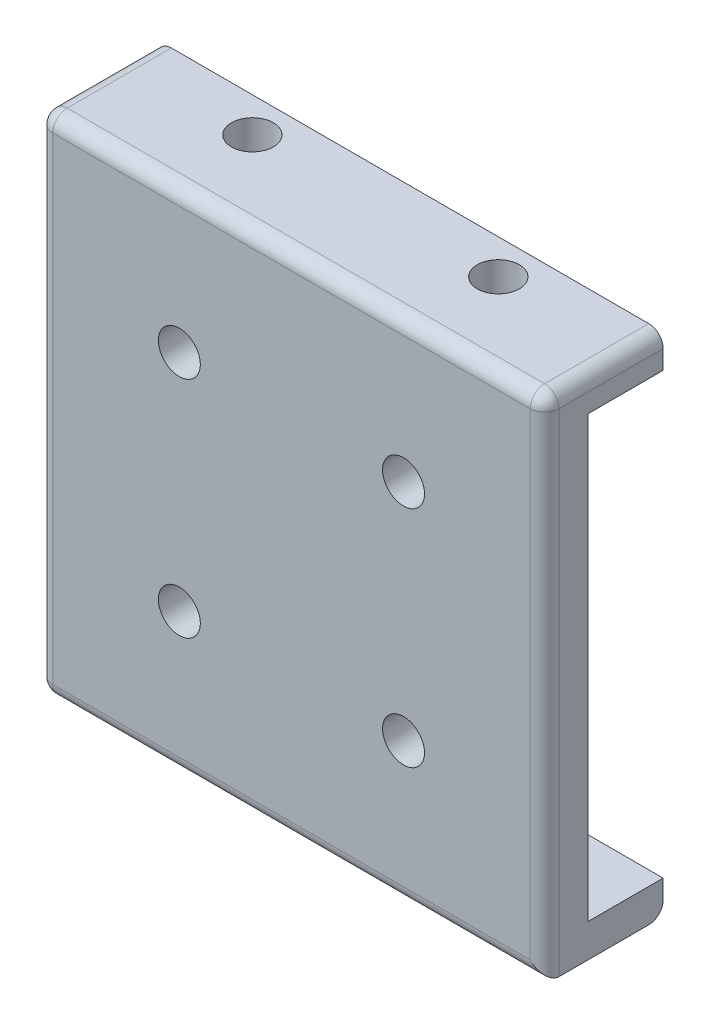
ISO-10303-21;
HEADER;
FILE_DESCRIPTION(('STEP AP214'),'2;1');
FILE_NAME('part.step','',(''),(''),'','','');
FILE_SCHEMA(('AUTOMOTIVE_DESIGN { 1 0 10303 214 1 1 1 1 }'));
ENDSEC;
DATA;
#1=APPLICATION_CONTEXT('core data for automotive mechanical design processes');
#2=APPLICATION_PROTOCOL_DEFINITION('international standard','automotive_design',2000,#1);
#3=PRODUCT_CONTEXT('',#1,'mechanical');
#4=PRODUCT('Part','Part','',(#3));
#5=PRODUCT_RELATED_PRODUCT_CATEGORY('part','',(#4));
#6=PRODUCT_DEFINITION_FORMATION('','',#4);
#7=PRODUCT_DEFINITION_CONTEXT('part definition',#1,'design');
#8=PRODUCT_DEFINITION('design','',#6,#7);
#9=PRODUCT_DEFINITION_SHAPE('','',#8);
#10=(LENGTH_UNIT() NAMED_UNIT(*) SI_UNIT(.MILLI.,.METRE.));
#11=(NAMED_UNIT(*) PLANE_ANGLE_UNIT() SI_UNIT($,.RADIAN.));
#12=(NAMED_UNIT(*) SI_UNIT($,.STERADIAN.) SOLID_ANGLE_UNIT());
#13=UNCERTAINTY_MEASURE_WITH_UNIT(LENGTH_MEASURE(1.E-05),#10,'distance_accuracy_value','');
#14=(GEOMETRIC_REPRESENTATION_CONTEXT(3) GLOBAL_UNCERTAINTY_ASSIGNED_CONTEXT((#13)) GLOBAL_UNIT_ASSIGNED_CONTEXT((#10,
#11,#12)) REPRESENTATION_CONTEXT('',''));
#15=CARTESIAN_POINT('',(0.,0.,0.));
#16=DIRECTION('',(0.,0.,1.));
#17=DIRECTION('',(1.,0.,0.));
#18=AXIS2_PLACEMENT_3D('',#15,#16,#17);
#19=CARTESIAN_POINT('',(0.,0.,0.));
#20=DIRECTION('',(0.,0.,1.));
#21=DIRECTION('',(1.,0.,0.));
#22=AXIS2_PLACEMENT_3D('',#19,#20,#21);
#23=PLANE('',#22);
#24=CARTESIAN_POINT('',(4.84893048128344,13.3649732620321,0.));
#25=DIRECTION('',(0.,0.,-1.));
#26=DIRECTION('',(-1.,0.,0.));
#27=AXIS2_PLACEMENT_3D('',#24,#25,#26);
#28=CIRCLE('',#27,1.44999999999999);
#29=CARTESIAN_POINT('',(3.39893048128345,13.3649732620321,0.));
#30=VERTEX_POINT('',#29);
#31=EDGE_CURVE('E338',#30,#30,#28,.T.);
#32=ORIENTED_EDGE('',*,*,#31,.F.);
#33=EDGE_LOOP('',(#32));
#34=FACE_BOUND('',#33,.T.);
#35=CARTESIAN_POINT('',(-10.6510695187166,13.3649732620321,0.));
#36=DIRECTION('',(0.,0.,-1.));
#37=DIRECTION('',(-1.,0.,0.));
#38=AXIS2_PLACEMENT_3D('',#35,#36,#37);
#39=CIRCLE('',#38,1.44999999999999);
#40=CARTESIAN_POINT('',(-12.1010695187165,13.3649732620321,0.));
#41=VERTEX_POINT('',#40);
#42=EDGE_CURVE('E346',#41,#41,#39,.T.);
#43=ORIENTED_EDGE('',*,*,#42,.F.);
#44=EDGE_LOOP('',(#43));
#45=FACE_BOUND('',#44,.T.);
#46=CARTESIAN_POINT('',(-10.6510695187166,-2.13502673796792,0.));
#47=DIRECTION('',(0.,0.,-1.));
#48=DIRECTION('',(-1.,0.,0.));
#49=AXIS2_PLACEMENT_3D('',#46,#47,#48);
#50=CIRCLE('',#49,1.44999999999999);
#51=CARTESIAN_POINT('',(-12.1010695187165,-2.13502673796792,0.));
#52=VERTEX_POINT('',#51);
#53=EDGE_CURVE('E354',#52,#52,#50,.T.);
#54=ORIENTED_EDGE('',*,*,#53,.F.);
#55=EDGE_LOOP('',(#54));
#56=FACE_BOUND('',#55,.T.);
#57=CARTESIAN_POINT('',(4.84893048128344,-2.13502673796792,0.));
#58=DIRECTION('',(0.,0.,-1.));
#59=DIRECTION('',(-1.,0.,0.));
#60=AXIS2_PLACEMENT_3D('',#57,#58,#59);
#61=CIRCLE('',#60,1.44999999999999);
#62=CARTESIAN_POINT('',(3.39893048128345,-2.13502673796792,0.));
#63=VERTEX_POINT('',#62);
#64=EDGE_CURVE('E360',#63,#63,#61,.T.);
#65=ORIENTED_EDGE('',*,*,#64,.F.);
#66=EDGE_LOOP('',(#65));
#67=FACE_BOUND('',#66,.T.);
#68=DIRECTION('',(1.,0.,0.));
#69=VECTOR('',#68,1.);
#70=CARTESIAN_POINT('',(14.5989304812834,-9.58502673796792,0.));
#71=LINE('',#70,#69);
#72=CARTESIAN_POINT('',(-20.4010695187166,-9.58502673796792,0.));
#73=VERTEX_POINT('',#72);
#74=CARTESIAN_POINT('',(14.5989304812834,-9.58502673796792,0.));
#75=VERTEX_POINT('',#74);
#76=EDGE_CURVE('E176',#73,#75,#71,.T.);
#77=ORIENTED_EDGE('',*,*,#76,.F.);
#78=DIRECTION('',(0.,-1.,0.));
#79=VECTOR('',#78,1.);
#80=CARTESIAN_POINT('',(-20.4010695187166,23.1149732620321,0.));
#81=LINE('',#80,#79);
#82=CARTESIAN_POINT('',(-20.4010695187166,20.8149732620321,0.));
#83=VERTEX_POINT('',#82);
#84=EDGE_CURVE('E163',#83,#73,#81,.T.);
#85=ORIENTED_EDGE('',*,*,#84,.F.);
#86=DIRECTION('',(-1.,0.,0.));
#87=VECTOR('',#86,1.);
#88=CARTESIAN_POINT('',(14.5989304812834,20.8149732620321,0.));
#89=LINE('',#88,#87);
#90=CARTESIAN_POINT('',(14.5989304812834,20.8149732620321,0.));
#91=VERTEX_POINT('',#90);
#92=EDGE_CURVE('E167',#91,#83,#89,.T.);
#93=ORIENTED_EDGE('',*,*,#92,.F.);
#94=DIRECTION('',(0.,1.,0.));
#95=VECTOR('',#94,1.);
#96=CARTESIAN_POINT('',(14.5989304812834,23.1149732620321,0.));
#97=LINE('',#96,#95);
#98=EDGE_CURVE('E197',#75,#91,#97,.T.);
#99=ORIENTED_EDGE('',*,*,#98,.F.);
#100=EDGE_LOOP('',(#77,#85,#93,#99));
#101=FACE_BOUND('',#100,.T.);
#102=ADVANCED_FACE('F35',(#34,#45,#56,#67,#101),#23,.F.);
#103=CARTESIAN_POINT('',(-20.4010695187166,23.1149732620321,3.));
#104=DIRECTION('',(1.,0.,0.));
#105=DIRECTION('',(0.,1.,0.));
#106=AXIS2_PLACEMENT_3D('',#103,#104,#105);
#107=PLANE('',#106);
#108=DIRECTION('',(0.,1.,0.));
#109=VECTOR('',#108,1.);
#110=CARTESIAN_POINT('',(-20.4010695187166,-11.8850267379679,-5.2));
#111=LINE('',#110,#109);
#112=CARTESIAN_POINT('',(-20.4010695187166,-10.8850267379679,-5.2));
#113=VERTEX_POINT('',#112);
#114=CARTESIAN_POINT('',(-20.4010695187166,-9.58502673796792,-5.2));
#115=VERTEX_POINT('',#114);
#116=EDGE_CURVE('E146',#113,#115,#111,.T.);
#117=ORIENTED_EDGE('',*,*,#116,.F.);
#118=DIRECTION('',(0.,0.,-1.));
#119=VECTOR('',#118,1.);
#120=CARTESIAN_POINT('',(-20.4010695187166,-10.8850267379679,3.));
#121=LINE('',#120,#119);
#122=CARTESIAN_POINT('',(-20.4010695187166,-10.8850267379679,2.));
#123=VERTEX_POINT('',#122);
#124=EDGE_CURVE('E217',#113,#123,#121,.F.);
#125=ORIENTED_EDGE('',*,*,#124,.T.);
#126=DIRECTION('',(0.,-1.,0.));
#127=VECTOR('',#126,1.);
#128=CARTESIAN_POINT('',(-20.4010695187166,23.1149732620321,2.));
#129=LINE('',#128,#127);
#130=CARTESIAN_POINT('',(-20.4010695187166,22.1149732620321,2.));
#131=VERTEX_POINT('',#130);
#132=EDGE_CURVE('E213',#123,#131,#129,.F.);
#133=ORIENTED_EDGE('',*,*,#132,.T.);
#134=DIRECTION('',(0.,0.,-1.));
#135=VECTOR('',#134,1.);
#136=CARTESIAN_POINT('',(-20.4010695187166,22.1149732620321,3.));
#137=LINE('',#136,#135);
#138=CARTESIAN_POINT('',(-20.4010695187166,22.1149732620321,-5.2));
#139=VERTEX_POINT('',#138);
#140=EDGE_CURVE('E215',#131,#139,#137,.T.);
#141=ORIENTED_EDGE('',*,*,#140,.T.);
#142=DIRECTION('',(0.,1.,0.));
#143=VECTOR('',#142,1.);
#144=CARTESIAN_POINT('',(-20.4010695187166,23.1149732620321,-5.2));
#145=LINE('',#144,#143);
#146=CARTESIAN_POINT('',(-20.4010695187166,20.8149732620321,-5.2));
#147=VERTEX_POINT('',#146);
#148=EDGE_CURVE('E183',#147,#139,#145,.T.);
#149=ORIENTED_EDGE('',*,*,#148,.F.);
#150=DIRECTION('',(0.,0.,1.));
#151=VECTOR('',#150,1.);
#152=CARTESIAN_POINT('',(-20.4010695187166,20.8149732620321,-5.2));
#153=LINE('',#152,#151);
#154=EDGE_CURVE('E189',#147,#83,#153,.T.);
#155=ORIENTED_EDGE('',*,*,#154,.T.);
#156=ORIENTED_EDGE('',*,*,#84,.T.);
#157=DIRECTION('',(0.,0.,1.));
#158=VECTOR('',#157,1.);
#159=CARTESIAN_POINT('',(-20.4010695187166,-9.58502673796792,-5.2));
#160=LINE('',#159,#158);
#161=EDGE_CURVE('E160',#115,#73,#160,.T.);
#162=ORIENTED_EDGE('',*,*,#161,.F.);
#163=EDGE_LOOP('',(#117,#125,#133,#141,#149,#155,#156,#162));
#164=FACE_BOUND('',#163,.T.);
#165=ADVANCED_FACE('F161',(#164),#107,.F.);
#166=CARTESIAN_POINT('',(-20.4010695187166,-11.8850267379679,3.));
#167=DIRECTION('',(0.,1.,0.));
#168=DIRECTION('',(-1.,0.,0.));
#169=AXIS2_PLACEMENT_3D('',#166,#167,#168);
#170=PLANE('',#169);
#171=CARTESIAN_POINT('',(-11.4010695187166,-11.8850267379679,-2.8));
#172=DIRECTION('',(0.,1.,0.));
#173=DIRECTION('',(0.,0.,1.));
#174=AXIS2_PLACEMENT_3D('',#171,#172,#173);
#175=CIRCLE('',#174,1.45);
#176=CARTESIAN_POINT('',(-11.7785612404801,-11.8850267379679,-4.2));
#177=VERTEX_POINT('',#176);
#178=CARTESIAN_POINT('',(-11.023577796953,-11.8850267379679,-4.2));
#179=VERTEX_POINT('',#178);
#180=EDGE_CURVE('E369',#177,#179,#175,.T.);
#181=ORIENTED_EDGE('',*,*,#180,.T.);
#182=DIRECTION('',(-1.,0.,0.));
#183=VECTOR('',#182,1.);
#184=CARTESIAN_POINT('',(-20.4010695187166,-11.8850267379679,-4.2));
#185=LINE('',#184,#183);
#186=CARTESIAN_POINT('',(5.22143875951991,-11.8850267379679,-4.2));
#187=VERTEX_POINT('',#186);
#188=EDGE_CURVE('E211',#179,#187,#185,.F.);
#189=ORIENTED_EDGE('',*,*,#188,.T.);
#190=CARTESIAN_POINT('',(5.59893048128344,-11.8850267379679,-2.8));
#191=DIRECTION('',(0.,1.,0.));
#192=DIRECTION('',(0.,0.,1.));
#193=AXIS2_PLACEMENT_3D('',#190,#191,#192);
#194=CIRCLE('',#193,1.45);
#195=CARTESIAN_POINT('',(5.97642220304697,-11.8850267379679,-4.2));
#196=VERTEX_POINT('',#195);
#197=EDGE_CURVE('E381',#187,#196,#194,.T.);
#198=ORIENTED_EDGE('',*,*,#197,.T.);
#199=DIRECTION('',(-1.,0.,0.));
#200=VECTOR('',#199,1.);
#201=CARTESIAN_POINT('',(-20.4010695187166,-11.8850267379679,-4.2));
#202=LINE('',#201,#200);
#203=CARTESIAN_POINT('',(14.5989304812834,-11.8850267379679,-4.2));
#204=VERTEX_POINT('',#203);
#205=EDGE_CURVE('E209',#196,#204,#202,.F.);
#206=ORIENTED_EDGE('',*,*,#205,.T.);
#207=DIRECTION('',(0.,0.,-1.));
#208=VECTOR('',#207,1.);
#209=CARTESIAN_POINT('',(14.5989304812834,-11.8850267379679,3.));
#210=LINE('',#209,#208);
#211=CARTESIAN_POINT('',(14.5989304812834,-11.8850267379679,2.));
#212=VERTEX_POINT('',#211);
#213=EDGE_CURVE('E199',#212,#204,#210,.T.);
#214=ORIENTED_EDGE('',*,*,#213,.F.);
#215=DIRECTION('',(1.,0.,0.));
#216=VECTOR('',#215,1.);
#217=CARTESIAN_POINT('',(-20.4010695187166,-11.8850267379679,2.));
#218=LINE('',#217,#216);
#219=CARTESIAN_POINT('',(-19.4010695187166,-11.8850267379679,2.));
#220=VERTEX_POINT('',#219);
#221=EDGE_CURVE('E202',#212,#220,#218,.F.);
#222=ORIENTED_EDGE('',*,*,#221,.T.);
#223=DIRECTION('',(0.,0.,-1.));
#224=VECTOR('',#223,1.);
#225=CARTESIAN_POINT('',(-19.4010695187166,-11.8850267379679,3.));
#226=LINE('',#225,#224);
#227=CARTESIAN_POINT('',(-19.4010695187166,-11.8850267379679,-4.2));
#228=VERTEX_POINT('',#227);
#229=EDGE_CURVE('E204',#220,#228,#226,.T.);
#230=ORIENTED_EDGE('',*,*,#229,.T.);
#231=DIRECTION('',(-1.,0.,0.));
#232=VECTOR('',#231,1.);
#233=CARTESIAN_POINT('',(-20.4010695187166,-11.8850267379679,-4.2));
#234=LINE('',#233,#232);
#235=EDGE_CURVE('E207',#228,#177,#234,.F.);
#236=ORIENTED_EDGE('',*,*,#235,.T.);
#237=EDGE_LOOP('',(#181,#189,#198,#206,#214,#222,#230,#236));
#238=FACE_BOUND('',#237,.T.);
#239=ADVANCED_FACE('F289',(#238),#170,.F.);
#240=CARTESIAN_POINT('',(14.5989304812834,23.1149732620321,3.));
#241=DIRECTION('',(-1.,0.,0.));
#242=DIRECTION('',(0.,0.,1.));
#243=AXIS2_PLACEMENT_3D('',#240,#241,#242);
#244=PLANE('',#243);
#245=ORIENTED_EDGE('',*,*,#213,.T.);
#246=CARTESIAN_POINT('',(14.5989304812834,-10.8850267379679,-4.2));
#247=DIRECTION('',(-1.,0.,0.));
#248=DIRECTION('',(0.,0.,1.));
#249=AXIS2_PLACEMENT_3D('',#246,#247,#248);
#250=CIRCLE('',#249,1.);
#251=CARTESIAN_POINT('',(14.5989304812834,-10.8850267379679,-5.2));
#252=VERTEX_POINT('',#251);
#253=EDGE_CURVE('E391',#204,#252,#250,.F.);
#254=ORIENTED_EDGE('',*,*,#253,.T.);
#255=DIRECTION('',(0.,-1.,0.));
#256=VECTOR('',#255,1.);
#257=CARTESIAN_POINT('',(14.5989304812834,-11.8850267379679,-5.2));
#258=LINE('',#257,#256);
#259=CARTESIAN_POINT('',(14.5989304812834,-9.58502673796792,-5.2));
#260=VERTEX_POINT('',#259);
#261=EDGE_CURVE('E157',#260,#252,#258,.T.);
#262=ORIENTED_EDGE('',*,*,#261,.F.);
#263=DIRECTION('',(0.,0.,1.));
#264=VECTOR('',#263,1.);
#265=CARTESIAN_POINT('',(14.5989304812834,-9.58502673796792,-5.2));
#266=LINE('',#265,#264);
#267=EDGE_CURVE('E168',#260,#75,#266,.T.);
#268=ORIENTED_EDGE('',*,*,#267,.T.);
#269=ORIENTED_EDGE('',*,*,#98,.T.);
#270=DIRECTION('',(0.,0.,1.));
#271=VECTOR('',#270,1.);
#272=CARTESIAN_POINT('',(14.5989304812834,20.8149732620321,-5.2));
#273=LINE('',#272,#271);
#274=CARTESIAN_POINT('',(14.5989304812834,20.8149732620321,-5.2));
#275=VERTEX_POINT('',#274);
#276=EDGE_CURVE('E193',#275,#91,#273,.T.);
#277=ORIENTED_EDGE('',*,*,#276,.F.);
#278=DIRECTION('',(0.,-1.,0.));
#279=VECTOR('',#278,1.);
#280=CARTESIAN_POINT('',(14.5989304812834,23.1149732620321,-5.2));
#281=LINE('',#280,#279);
#282=CARTESIAN_POINT('',(14.5989304812834,22.1149732620321,-5.2));
#283=VERTEX_POINT('',#282);
#284=EDGE_CURVE('E179',#283,#275,#281,.T.);
#285=ORIENTED_EDGE('',*,*,#284,.F.);
#286=DIRECTION('',(0.,0.,-1.));
#287=VECTOR('',#286,1.);
#288=CARTESIAN_POINT('',(14.5989304812834,22.1149732620321,3.));
#289=LINE('',#288,#287);
#290=CARTESIAN_POINT('',(14.5989304812834,22.1149732620321,2.));
#291=VERTEX_POINT('',#290);
#292=EDGE_CURVE('E424',#283,#291,#289,.F.);
#293=ORIENTED_EDGE('',*,*,#292,.T.);
#294=DIRECTION('',(0.,1.,0.));
#295=VECTOR('',#294,1.);
#296=CARTESIAN_POINT('',(14.5989304812834,-11.8850267379679,2.));
#297=LINE('',#296,#295);
#298=EDGE_CURVE('E425',#291,#212,#297,.F.);
#299=ORIENTED_EDGE('',*,*,#298,.T.);
#300=EDGE_LOOP('',(#245,#254,#262,#268,#269,#277,#285,#293,#299));
#301=FACE_BOUND('',#300,.T.);
#302=ADVANCED_FACE('F285',(#301),#244,.F.);
#303=CARTESIAN_POINT('',(-20.4010695187166,23.1149732620321,3.));
#304=DIRECTION('',(0.,-1.,0.));
#305=DIRECTION('',(0.,0.,-1.));
#306=AXIS2_PLACEMENT_3D('',#303,#304,#305);
#307=PLANE('',#306);
#308=DIRECTION('',(1.,0.,0.));
#309=VECTOR('',#308,1.);
#310=CARTESIAN_POINT('',(14.5989304812834,23.1149732620321,-5.2));
#311=LINE('',#310,#309);
#312=CARTESIAN_POINT('',(-19.4010695187166,23.1149732620321,-5.2));
#313=VERTEX_POINT('',#312);
#314=CARTESIAN_POINT('',(13.5989304812834,23.1149732620321,-5.2));
#315=VERTEX_POINT('',#314);
#316=EDGE_CURVE('E186',#313,#315,#311,.T.);
#317=ORIENTED_EDGE('',*,*,#316,.F.);
#318=DIRECTION('',(0.,0.,-1.));
#319=VECTOR('',#318,1.);
#320=CARTESIAN_POINT('',(-19.4010695187166,23.1149732620321,3.));
#321=LINE('',#320,#319);
#322=CARTESIAN_POINT('',(-19.4010695187166,23.1149732620321,2.));
#323=VERTEX_POINT('',#322);
#324=EDGE_CURVE('E227',#313,#323,#321,.F.);
#325=ORIENTED_EDGE('',*,*,#324,.T.);
#326=DIRECTION('',(-1.,0.,0.));
#327=VECTOR('',#326,1.);
#328=CARTESIAN_POINT('',(14.5989304812834,23.1149732620321,2.));
#329=LINE('',#328,#327);
#330=CARTESIAN_POINT('',(13.5989304812834,23.1149732620321,2.));
#331=VERTEX_POINT('',#330);
#332=EDGE_CURVE('E223',#323,#331,#329,.F.);
#333=ORIENTED_EDGE('',*,*,#332,.T.);
#334=DIRECTION('',(0.,0.,-1.));
#335=VECTOR('',#334,1.);
#336=CARTESIAN_POINT('',(13.5989304812834,23.1149732620321,3.));
#337=LINE('',#336,#335);
#338=EDGE_CURVE('E225',#331,#315,#337,.T.);
#339=ORIENTED_EDGE('',*,*,#338,.T.);
#340=EDGE_LOOP('',(#317,#325,#333,#339));
#341=FACE_BOUND('',#340,.T.);
#342=CARTESIAN_POINT('',(-11.4010695187166,23.1149732620321,-2.8));
#343=DIRECTION('',(0.,1.,0.));
#344=DIRECTION('',(0.,0.,1.));
#345=AXIS2_PLACEMENT_3D('',#342,#343,#344);
#346=CIRCLE('',#345,1.45);
#347=CARTESIAN_POINT('',(-11.4010695187166,23.1149732620321,-1.35));
#348=VERTEX_POINT('',#347);
#349=EDGE_CURVE('E366',#348,#348,#346,.T.);
#350=ORIENTED_EDGE('',*,*,#349,.F.);
#351=EDGE_LOOP('',(#350));
#352=FACE_BOUND('',#351,.T.);
#353=CARTESIAN_POINT('',(5.59893048128344,23.1149732620321,-2.8));
#354=DIRECTION('',(0.,1.,0.));
#355=DIRECTION('',(0.,0.,1.));
#356=AXIS2_PLACEMENT_3D('',#353,#354,#355);
#357=CIRCLE('',#356,1.45);
#358=CARTESIAN_POINT('',(5.59893048128344,23.1149732620321,-1.35));
#359=VERTEX_POINT('',#358);
#360=EDGE_CURVE('E378',#359,#359,#357,.T.);
#361=ORIENTED_EDGE('',*,*,#360,.F.);
#362=EDGE_LOOP('',(#361));
#363=FACE_BOUND('',#362,.T.);
#364=ADVANCED_FACE('F279',(#341,#352,#363),#307,.F.);
#365=CARTESIAN_POINT('',(0.,0.,3.));
#366=DIRECTION('',(0.,0.,1.));
#367=DIRECTION('',(1.,0.,0.));
#368=AXIS2_PLACEMENT_3D('',#365,#366,#367);
#369=PLANE('',#368);
#370=DIRECTION('',(0.,1.,0.));
#371=VECTOR('',#370,1.);
#372=CARTESIAN_POINT('',(13.5989304812834,23.1149732620321,3.));
#373=LINE('',#372,#371);
#374=CARTESIAN_POINT('',(13.5989304812834,-10.8850267379679,3.));
#375=VERTEX_POINT('',#374);
#376=CARTESIAN_POINT('',(13.5989304812834,22.1149732620321,3.));
#377=VERTEX_POINT('',#376);
#378=EDGE_CURVE('E44',#375,#377,#373,.T.);
#379=ORIENTED_EDGE('',*,*,#378,.T.);
#380=DIRECTION('',(-1.,0.,0.));
#381=VECTOR('',#380,1.);
#382=CARTESIAN_POINT('',(-20.4010695187166,22.1149732620321,3.));
#383=LINE('',#382,#381);
#384=CARTESIAN_POINT('',(-19.4010695187166,22.1149732620321,3.));
#385=VERTEX_POINT('',#384);
#386=EDGE_CURVE('E11',#377,#385,#383,.T.);
#387=ORIENTED_EDGE('',*,*,#386,.T.);
#388=DIRECTION('',(0.,-1.,0.));
#389=VECTOR('',#388,1.);
#390=CARTESIAN_POINT('',(-19.4010695187166,-11.8850267379679,3.));
#391=LINE('',#390,#389);
#392=CARTESIAN_POINT('',(-19.4010695187166,-10.8850267379679,3.));
#393=VERTEX_POINT('',#392);
#394=EDGE_CURVE('E58',#385,#393,#391,.T.);
#395=ORIENTED_EDGE('',*,*,#394,.T.);
#396=DIRECTION('',(1.,0.,0.));
#397=VECTOR('',#396,1.);
#398=CARTESIAN_POINT('',(14.5989304812834,-10.8850267379679,3.));
#399=LINE('',#398,#397);
#400=EDGE_CURVE('E402',#393,#375,#399,.T.);
#401=ORIENTED_EDGE('',*,*,#400,.T.);
#402=EDGE_LOOP('',(#379,#387,#395,#401));
#403=FACE_BOUND('',#402,.T.);
#404=CARTESIAN_POINT('',(4.84893048128344,13.3649732620321,3.));
#405=DIRECTION('',(0.,0.,-1.));
#406=DIRECTION('',(-1.,0.,0.));
#407=AXIS2_PLACEMENT_3D('',#404,#405,#406);
#408=CIRCLE('',#407,1.45);
#409=CARTESIAN_POINT('',(3.39893048128344,13.3649732620321,3.));
#410=VERTEX_POINT('',#409);
#411=EDGE_CURVE('E341',#410,#410,#408,.T.);
#412=ORIENTED_EDGE('',*,*,#411,.T.);
#413=EDGE_LOOP('',(#412));
#414=FACE_BOUND('',#413,.T.);
#415=CARTESIAN_POINT('',(-10.6510695187166,13.3649732620321,3.));
#416=DIRECTION('',(0.,0.,-1.));
#417=DIRECTION('',(-1.,0.,0.));
#418=AXIS2_PLACEMENT_3D('',#415,#416,#417);
#419=CIRCLE('',#418,1.45);
#420=CARTESIAN_POINT('',(-12.1010695187166,13.3649732620321,3.));
#421=VERTEX_POINT('',#420);
#422=EDGE_CURVE('E351',#421,#421,#419,.T.);
#423=ORIENTED_EDGE('',*,*,#422,.T.);
#424=EDGE_LOOP('',(#423));
#425=FACE_BOUND('',#424,.T.);
#426=CARTESIAN_POINT('',(-10.6510695187166,-2.13502673796792,3.));
#427=DIRECTION('',(0.,0.,-1.));
#428=DIRECTION('',(-1.,0.,0.));
#429=AXIS2_PLACEMENT_3D('',#426,#427,#428);
#430=CIRCLE('',#429,1.45);
#431=CARTESIAN_POINT('',(-12.1010695187166,-2.13502673796792,3.));
#432=VERTEX_POINT('',#431);
#433=EDGE_CURVE('E357',#432,#432,#430,.T.);
#434=ORIENTED_EDGE('',*,*,#433,.T.);
#435=EDGE_LOOP('',(#434));
#436=FACE_BOUND('',#435,.T.);
#437=CARTESIAN_POINT('',(4.84893048128344,-2.13502673796792,3.));
#438=DIRECTION('',(0.,0.,-1.));
#439=DIRECTION('',(-1.,0.,0.));
#440=AXIS2_PLACEMENT_3D('',#437,#438,#439);
#441=CIRCLE('',#440,1.45);
#442=CARTESIAN_POINT('',(3.39893048128344,-2.13502673796792,3.));
#443=VERTEX_POINT('',#442);
#444=EDGE_CURVE('E363',#443,#443,#441,.T.);
#445=ORIENTED_EDGE('',*,*,#444,.T.);
#446=EDGE_LOOP('',(#445));
#447=FACE_BOUND('',#446,.T.);
#448=ADVANCED_FACE('F275',(#403,#414,#425,#436,#447),#369,.T.);
#449=CARTESIAN_POINT('',(14.5989304812834,20.8149732620321,-5.2));
#450=DIRECTION('',(0.,1.,0.));
#451=DIRECTION('',(0.,0.,1.));
#452=AXIS2_PLACEMENT_3D('',#449,#450,#451);
#453=PLANE('',#452);
#454=CARTESIAN_POINT('',(-11.4010695187166,20.8149732620321,-2.8));
#455=DIRECTION('',(0.,1.,0.));
#456=DIRECTION('',(0.,0.,1.));
#457=AXIS2_PLACEMENT_3D('',#454,#455,#456);
#458=CIRCLE('',#457,1.45);
#459=CARTESIAN_POINT('',(-11.4010695187166,20.8149732620321,-1.35));
#460=VERTEX_POINT('',#459);
#461=EDGE_CURVE('E372',#460,#460,#458,.T.);
#462=ORIENTED_EDGE('',*,*,#461,.T.);
#463=EDGE_LOOP('',(#462));
#464=FACE_BOUND('',#463,.T.);
#465=CARTESIAN_POINT('',(5.59893048128344,20.8149732620321,-2.8));
#466=DIRECTION('',(0.,1.,0.));
#467=DIRECTION('',(0.,0.,1.));
#468=AXIS2_PLACEMENT_3D('',#465,#466,#467);
#469=CIRCLE('',#468,1.45);
#470=CARTESIAN_POINT('',(5.59893048128344,20.8149732620321,-1.35));
#471=VERTEX_POINT('',#470);
#472=EDGE_CURVE('E177',#471,#471,#469,.T.);
#473=ORIENTED_EDGE('',*,*,#472,.T.);
#474=EDGE_LOOP('',(#473));
#475=FACE_BOUND('',#474,.T.);
#476=ORIENTED_EDGE('',*,*,#92,.T.);
#477=ORIENTED_EDGE('',*,*,#154,.F.);
#478=DIRECTION('',(-1.,0.,0.));
#479=VECTOR('',#478,1.);
#480=CARTESIAN_POINT('',(14.5989304812834,20.8149732620321,-5.2));
#481=LINE('',#480,#479);
#482=EDGE_CURVE('E181',#275,#147,#481,.T.);
#483=ORIENTED_EDGE('',*,*,#482,.F.);
#484=ORIENTED_EDGE('',*,*,#276,.T.);
#485=EDGE_LOOP('',(#476,#477,#483,#484));
#486=FACE_BOUND('',#485,.T.);
#487=ADVANCED_FACE('F271',(#464,#475,#486),#453,.F.);
#488=CARTESIAN_POINT('',(0.,0.,-5.2));
#489=DIRECTION('',(0.,0.,-1.));
#490=DIRECTION('',(-1.,0.,0.));
#491=AXIS2_PLACEMENT_3D('',#488,#489,#490);
#492=PLANE('',#491);
#493=ORIENTED_EDGE('',*,*,#148,.T.);
#494=CARTESIAN_POINT('',(-19.4010695187166,22.1149732620321,-5.2));
#495=DIRECTION('',(0.,0.,-1.));
#496=DIRECTION('',(-1.,0.,0.));
#497=AXIS2_PLACEMENT_3D('',#494,#495,#496);
#498=CIRCLE('',#497,1.);
#499=EDGE_CURVE('E221',#139,#313,#498,.T.);
#500=ORIENTED_EDGE('',*,*,#499,.T.);
#501=ORIENTED_EDGE('',*,*,#316,.T.);
#502=CARTESIAN_POINT('',(13.5989304812834,22.1149732620321,-5.2));
#503=DIRECTION('',(0.,0.,-1.));
#504=DIRECTION('',(-1.,0.,0.));
#505=AXIS2_PLACEMENT_3D('',#502,#503,#504);
#506=CIRCLE('',#505,1.);
#507=EDGE_CURVE('E219',#315,#283,#506,.T.);
#508=ORIENTED_EDGE('',*,*,#507,.T.);
#509=ORIENTED_EDGE('',*,*,#284,.T.);
#510=ORIENTED_EDGE('',*,*,#482,.T.);
#511=EDGE_LOOP('',(#493,#500,#501,#508,#509,#510));
#512=FACE_BOUND('',#511,.T.);
#513=ADVANCED_FACE('F267',(#512),#492,.T.);
#514=CARTESIAN_POINT('',(14.5989304812834,-9.58502673796792,-5.2));
#515=DIRECTION('',(0.,-1.,0.));
#516=DIRECTION('',(0.,0.,-1.));
#517=AXIS2_PLACEMENT_3D('',#514,#515,#516);
#518=PLANE('',#517);
#519=CARTESIAN_POINT('',(-11.4010695187166,-9.58502673796792,-2.8));
#520=DIRECTION('',(0.,-1.,0.));
#521=DIRECTION('',(0.,0.,-1.));
#522=AXIS2_PLACEMENT_3D('',#519,#520,#521);
#523=CIRCLE('',#522,1.45);
#524=CARTESIAN_POINT('',(-11.4010695187166,-9.58502673796792,-4.25));
#525=VERTEX_POINT('',#524);
#526=EDGE_CURVE('E375',#525,#525,#523,.T.);
#527=ORIENTED_EDGE('',*,*,#526,.T.);
#528=EDGE_LOOP('',(#527));
#529=FACE_BOUND('',#528,.T.);
#530=CARTESIAN_POINT('',(5.59893048128344,-9.58502673796792,-2.8));
#531=DIRECTION('',(0.,-1.,0.));
#532=DIRECTION('',(0.,0.,-1.));
#533=AXIS2_PLACEMENT_3D('',#530,#531,#532);
#534=CIRCLE('',#533,1.45);
#535=CARTESIAN_POINT('',(5.59893048128344,-9.58502673796792,-4.25));
#536=VERTEX_POINT('',#535);
#537=EDGE_CURVE('E384',#536,#536,#534,.T.);
#538=ORIENTED_EDGE('',*,*,#537,.T.);
#539=EDGE_LOOP('',(#538));
#540=FACE_BOUND('',#539,.T.);
#541=ORIENTED_EDGE('',*,*,#76,.T.);
#542=ORIENTED_EDGE('',*,*,#267,.F.);
#543=DIRECTION('',(1.,0.,0.));
#544=VECTOR('',#543,1.);
#545=CARTESIAN_POINT('',(14.5989304812834,-9.58502673796792,-5.2));
#546=LINE('',#545,#544);
#547=EDGE_CURVE('E151',#115,#260,#546,.T.);
#548=ORIENTED_EDGE('',*,*,#547,.F.);
#549=ORIENTED_EDGE('',*,*,#161,.T.);
#550=EDGE_LOOP('',(#541,#542,#548,#549));
#551=FACE_BOUND('',#550,.T.);
#552=ADVANCED_FACE('F170',(#529,#540,#551),#518,.F.);
#553=CARTESIAN_POINT('',(0.,0.,-5.2));
#554=DIRECTION('',(0.,0.,1.));
#555=DIRECTION('',(1.,0.,0.));
#556=AXIS2_PLACEMENT_3D('',#553,#554,#555);
#557=PLANE('',#556);
#558=ORIENTED_EDGE('',*,*,#261,.T.);
#559=DIRECTION('',(-1.,0.,0.));
#560=VECTOR('',#559,1.);
#561=CARTESIAN_POINT('',(0.,-10.8850267379679,-5.2));
#562=LINE('',#561,#560);
#563=EDGE_CURVE('E154',#252,#113,#562,.T.);
#564=ORIENTED_EDGE('',*,*,#563,.T.);
#565=ORIENTED_EDGE('',*,*,#116,.T.);
#566=ORIENTED_EDGE('',*,*,#547,.T.);
#567=EDGE_LOOP('',(#558,#564,#565,#566));
#568=FACE_BOUND('',#567,.T.);
#569=ADVANCED_FACE('F149',(#568),#557,.F.);
#570=CARTESIAN_POINT('',(5.59893048128344,23.1149732620321,-2.8));
#571=DIRECTION('',(0.,1.,0.));
#572=DIRECTION('',(0.,0.,1.));
#573=AXIS2_PLACEMENT_3D('',#570,#571,#572);
#574=CYLINDRICAL_SURFACE('',#573,1.45);
#575=ORIENTED_EDGE('',*,*,#360,.T.);
#576=EDGE_LOOP('',(#575));
#577=FACE_BOUND('',#576,.T.);
#578=ORIENTED_EDGE('',*,*,#472,.F.);
#579=EDGE_LOOP('',(#578));
#580=FACE_BOUND('',#579,.T.);
#581=ADVANCED_FACE('F257',(#577,#580),#574,.F.);
#582=ORIENTED_EDGE('',*,*,#197,.F.);
#583=CARTESIAN_POINT('',(5.22143875951991,-11.8850267379679,-4.2));
#584=CARTESIAN_POINT('',(5.26297414392257,-11.8850047692331,-4.21120509365087));
#585=CARTESIAN_POINT('',(5.30500984060054,-11.8848374984503,-4.22055114932932));
#586=CARTESIAN_POINT('',(5.38975990629714,-11.8844310252278,-4.2354774264971));
#587=CARTESIAN_POINT('',(5.43247451187328,-11.8841917971709,-4.24105630455068));
#588=CARTESIAN_POINT('',(5.51726258111985,-11.883864149221,-4.2483096187561));
#589=CARTESIAN_POINT('',(5.55932875579238,-11.8837724473928,-4.25006933779013));
#590=CARTESIAN_POINT('',(5.64343428575247,-11.8837796719366,-4.24992651912413));
#591=CARTESIAN_POINT('',(5.68547364399757,-11.8838785038321,-4.24802579646269));
#592=CARTESIAN_POINT('',(5.76916070836618,-11.8842110751147,-4.2405841518676));
#593=CARTESIAN_POINT('',(5.81080893061531,-11.8844445999176,-4.23504901811206));
#594=CARTESIAN_POINT('',(5.89394586822778,-11.8848425922223,-4.22030716964829));
#595=CARTESIAN_POINT('',(5.93542721972977,-11.8850062332467,-4.21105889546327));
#596=CARTESIAN_POINT('',(5.97642220304697,-11.8850267379679,-4.2));
#597=B_SPLINE_CURVE_WITH_KNOTS('',3,(#583,#584,#585,#586,#587,#588,#589,#590,#591,#592,#593,
#594,#595,#596),.UNSPECIFIED.,.F.,.F.,(4,2,2,2,2,2,4),(0.,0.1290170593211,0.258080103923027,
0.384230141323953,0.510317643037807,0.636204822753876,0.763542131635257),.UNSPECIFIED.);
#598=EDGE_CURVE('E238',#187,#196,#597,.T.);
#599=ORIENTED_EDGE('',*,*,#598,.T.);
#600=EDGE_LOOP('',(#582,#599));
#601=FACE_BOUND('',#600,.T.);
#602=ORIENTED_EDGE('',*,*,#537,.F.);
#603=EDGE_LOOP('',(#602));
#604=FACE_BOUND('',#603,.T.);
#605=ADVANCED_FACE('F261',(#601,#604),#574,.F.);
#606=CARTESIAN_POINT('',(-11.4010695187166,23.1149732620321,-2.8));
#607=DIRECTION('',(0.,1.,0.));
#608=DIRECTION('',(0.,0.,1.));
#609=AXIS2_PLACEMENT_3D('',#606,#607,#608);
#610=CYLINDRICAL_SURFACE('',#609,1.45);
#611=ORIENTED_EDGE('',*,*,#349,.T.);
#612=EDGE_LOOP('',(#611));
#613=FACE_BOUND('',#612,.T.);
#614=ORIENTED_EDGE('',*,*,#461,.F.);
#615=EDGE_LOOP('',(#614));
#616=FACE_BOUND('',#615,.T.);
#617=ADVANCED_FACE('F254',(#613,#616),#610,.F.);
#618=ORIENTED_EDGE('',*,*,#180,.F.);
#619=CARTESIAN_POINT('',(-11.7785612404801,-11.8850267379679,-4.2));
#620=CARTESIAN_POINT('',(-11.7370258560774,-11.8850047692331,-4.21120509365087));
#621=CARTESIAN_POINT('',(-11.6949901593995,-11.8848374984503,-4.22055114932932));
#622=CARTESIAN_POINT('',(-11.6102400937029,-11.8844310252278,-4.2354774264971));
#623=CARTESIAN_POINT('',(-11.5675254881267,-11.8841917971709,-4.24105630455068));
#624=CARTESIAN_POINT('',(-11.4827374188802,-11.883864149221,-4.2483096187561));
#625=CARTESIAN_POINT('',(-11.4406712442076,-11.8837724473928,-4.25006933779013));
#626=CARTESIAN_POINT('',(-11.3565657142475,-11.8837796719366,-4.24992651912412));
#627=CARTESIAN_POINT('',(-11.3145263560024,-11.8838785038321,-4.24802579646269));
#628=CARTESIAN_POINT('',(-11.2308392916338,-11.8842110751148,-4.2405841518676));
#629=CARTESIAN_POINT('',(-11.1891910693847,-11.8844445999177,-4.23504901811206));
#630=CARTESIAN_POINT('',(-11.1060541317722,-11.8848425922223,-4.22030716964829));
#631=CARTESIAN_POINT('',(-11.0645727802702,-11.8850062332467,-4.21105889546327));
#632=CARTESIAN_POINT('',(-11.023577796953,-11.8850267379679,-4.2));
#633=B_SPLINE_CURVE_WITH_KNOTS('',3,(#619,#620,#621,#622,#623,#624,#625,#626,#627,#628,#629,
#630,#631,#632),.UNSPECIFIED.,.F.,.F.,(4,2,2,2,2,2,4),(0.,0.1290170593211,0.258080103923026,
0.38423014132395,0.510317643037806,0.636204822753871,0.763542131635247),.UNSPECIFIED.);
#634=EDGE_CURVE('E230',#177,#179,#633,.T.);
#635=ORIENTED_EDGE('',*,*,#634,.T.);
#636=EDGE_LOOP('',(#618,#635));
#637=FACE_BOUND('',#636,.T.);
#638=ORIENTED_EDGE('',*,*,#526,.F.);
#639=EDGE_LOOP('',(#638));
#640=FACE_BOUND('',#639,.T.);
#641=ADVANCED_FACE('F249',(#637,#640),#610,.F.);
#642=CARTESIAN_POINT('',(4.84893048128344,-2.13502673796792,0.));
#643=DIRECTION('',(0.,0.,-1.));
#644=DIRECTION('',(-1.,0.,0.));
#645=AXIS2_PLACEMENT_3D('',#642,#643,#644);
#646=CYLINDRICAL_SURFACE('',#645,1.44999999999999);
#647=ORIENTED_EDGE('',*,*,#444,.F.);
#648=EDGE_LOOP('',(#647));
#649=FACE_BOUND('',#648,.T.);
#650=ORIENTED_EDGE('',*,*,#64,.T.);
#651=EDGE_LOOP('',(#650));
#652=FACE_BOUND('',#651,.T.);
#653=ADVANCED_FACE('F253',(#649,#652),#646,.F.);
#654=CARTESIAN_POINT('',(-10.6510695187166,-2.13502673796792,0.));
#655=DIRECTION('',(0.,0.,-1.));
#656=DIRECTION('',(-1.,0.,0.));
#657=AXIS2_PLACEMENT_3D('',#654,#655,#656);
#658=CYLINDRICAL_SURFACE('',#657,1.44999999999999);
#659=ORIENTED_EDGE('',*,*,#433,.F.);
#660=EDGE_LOOP('',(#659));
#661=FACE_BOUND('',#660,.T.);
#662=ORIENTED_EDGE('',*,*,#53,.T.);
#663=EDGE_LOOP('',(#662));
#664=FACE_BOUND('',#663,.T.);
#665=ADVANCED_FACE('F490',(#661,#664),#658,.F.);
#666=CARTESIAN_POINT('',(-10.6510695187166,13.3649732620321,0.));
#667=DIRECTION('',(0.,0.,-1.));
#668=DIRECTION('',(-1.,0.,0.));
#669=AXIS2_PLACEMENT_3D('',#666,#667,#668);
#670=CYLINDRICAL_SURFACE('',#669,1.44999999999999);
#671=ORIENTED_EDGE('',*,*,#422,.F.);
#672=EDGE_LOOP('',(#671));
#673=FACE_BOUND('',#672,.T.);
#674=ORIENTED_EDGE('',*,*,#42,.T.);
#675=EDGE_LOOP('',(#674));
#676=FACE_BOUND('',#675,.T.);
#677=ADVANCED_FACE('F484',(#673,#676),#670,.F.);
#678=CARTESIAN_POINT('',(4.84893048128344,13.3649732620321,0.));
#679=DIRECTION('',(0.,0.,-1.));
#680=DIRECTION('',(-1.,0.,0.));
#681=AXIS2_PLACEMENT_3D('',#678,#679,#680);
#682=CYLINDRICAL_SURFACE('',#681,1.44999999999999);
#683=ORIENTED_EDGE('',*,*,#411,.F.);
#684=EDGE_LOOP('',(#683));
#685=FACE_BOUND('',#684,.T.);
#686=ORIENTED_EDGE('',*,*,#31,.T.);
#687=EDGE_LOOP('',(#686));
#688=FACE_BOUND('',#687,.T.);
#689=ADVANCED_FACE('F480',(#685,#688),#682,.F.);
#690=CARTESIAN_POINT('',(13.5989304812834,22.1149732620321,3.));
#691=DIRECTION('',(0.,0.,-1.));
#692=DIRECTION('',(-1.,0.,0.));
#693=AXIS2_PLACEMENT_3D('',#690,#691,#692);
#694=CYLINDRICAL_SURFACE('',#693,1.);
#695=ORIENTED_EDGE('',*,*,#507,.F.);
#696=ORIENTED_EDGE('',*,*,#338,.F.);
#697=CARTESIAN_POINT('',(13.5989304812834,22.1149732620321,2.));
#698=DIRECTION('',(0.,0.,1.));
#699=DIRECTION('',(1.,0.,0.));
#700=AXIS2_PLACEMENT_3D('',#697,#698,#699);
#701=CIRCLE('',#700,1.);
#702=EDGE_CURVE('E332',#291,#331,#701,.T.);
#703=ORIENTED_EDGE('',*,*,#702,.F.);
#704=ORIENTED_EDGE('',*,*,#292,.F.);
#705=EDGE_LOOP('',(#695,#696,#703,#704));
#706=FACE_BOUND('',#705,.T.);
#707=ADVANCED_FACE('F37',(#706),#694,.T.);
#708=CARTESIAN_POINT('',(-19.4010695187166,22.1149732620321,3.));
#709=DIRECTION('',(0.,0.,-1.));
#710=DIRECTION('',(-1.,0.,0.));
#711=AXIS2_PLACEMENT_3D('',#708,#709,#710);
#712=CYLINDRICAL_SURFACE('',#711,1.);
#713=ORIENTED_EDGE('',*,*,#499,.F.);
#714=ORIENTED_EDGE('',*,*,#140,.F.);
#715=CARTESIAN_POINT('',(-19.4010695187166,22.1149732620321,2.));
#716=DIRECTION('',(0.,0.,1.));
#717=DIRECTION('',(1.,0.,0.));
#718=AXIS2_PLACEMENT_3D('',#715,#716,#717);
#719=CIRCLE('',#718,1.);
#720=EDGE_CURVE('E330',#323,#131,#719,.T.);
#721=ORIENTED_EDGE('',*,*,#720,.F.);
#722=ORIENTED_EDGE('',*,*,#324,.F.);
#723=EDGE_LOOP('',(#713,#714,#721,#722));
#724=FACE_BOUND('',#723,.T.);
#725=ADVANCED_FACE('F410',(#724),#712,.T.);
#726=CARTESIAN_POINT('',(0.,22.1149732620321,2.));
#727=DIRECTION('',(1.,0.,0.));
#728=DIRECTION('',(0.,0.,-1.));
#729=AXIS2_PLACEMENT_3D('',#726,#727,#728);
#730=CYLINDRICAL_SURFACE('',#729,1.);
#731=CARTESIAN_POINT('',(13.5989304812834,22.1149732620321,2.));
#732=DIRECTION('',(1.,0.,0.));
#733=DIRECTION('',(0.,0.,-1.));
#734=AXIS2_PLACEMENT_3D('',#731,#732,#733);
#735=CIRCLE('',#734,1.);
#736=EDGE_CURVE('E39',#331,#377,#735,.T.);
#737=ORIENTED_EDGE('',*,*,#736,.F.);
#738=ORIENTED_EDGE('',*,*,#332,.F.);
#739=CARTESIAN_POINT('',(-19.4010695187166,22.1149732620321,2.));
#740=DIRECTION('',(-1.,0.,0.));
#741=DIRECTION('',(0.,0.,1.));
#742=AXIS2_PLACEMENT_3D('',#739,#740,#741);
#743=CIRCLE('',#742,1.);
#744=EDGE_CURVE('E327',#385,#323,#743,.T.);
#745=ORIENTED_EDGE('',*,*,#744,.F.);
#746=ORIENTED_EDGE('',*,*,#386,.F.);
#747=EDGE_LOOP('',(#737,#738,#745,#746));
#748=FACE_BOUND('',#747,.T.);
#749=ADVANCED_FACE('F417',(#748),#730,.T.);
#750=CARTESIAN_POINT('',(13.5989304812834,22.1149732620321,2.));
#751=DIRECTION('',(0.,1.,0.));
#752=DIRECTION('',(-1.,0.,0.));
#753=AXIS2_PLACEMENT_3D('',#750,#751,#752);
#754=SPHERICAL_SURFACE('',#753,1.);
#755=ORIENTED_EDGE('',*,*,#702,.T.);
#756=ORIENTED_EDGE('',*,*,#736,.T.);
#757=CARTESIAN_POINT('',(13.5989304812834,22.1149732620321,2.));
#758=DIRECTION('',(0.,1.,0.));
#759=DIRECTION('',(0.,0.,1.));
#760=AXIS2_PLACEMENT_3D('',#757,#758,#759);
#761=CIRCLE('',#760,1.);
#762=EDGE_CURVE('E324',#291,#377,#761,.F.);
#763=ORIENTED_EDGE('',*,*,#762,.F.);
#764=EDGE_LOOP('',(#755,#756,#763));
#765=FACE_BOUND('',#764,.T.);
#766=ADVANCED_FACE('F460',(#765),#754,.T.);
#767=CARTESIAN_POINT('',(-19.4010695187166,22.1149732620321,2.));
#768=DIRECTION('',(0.,1.,0.));
#769=DIRECTION('',(0.,0.,1.));
#770=AXIS2_PLACEMENT_3D('',#767,#768,#769);
#771=SPHERICAL_SURFACE('',#770,1.);
#772=ORIENTED_EDGE('',*,*,#744,.T.);
#773=ORIENTED_EDGE('',*,*,#720,.T.);
#774=CARTESIAN_POINT('',(-19.4010695187166,22.1149732620321,2.));
#775=DIRECTION('',(0.,1.,0.));
#776=DIRECTION('',(0.,0.,1.));
#777=AXIS2_PLACEMENT_3D('',#774,#775,#776);
#778=CIRCLE('',#777,1.);
#779=EDGE_CURVE('E322',#385,#131,#778,.F.);
#780=ORIENTED_EDGE('',*,*,#779,.F.);
#781=EDGE_LOOP('',(#772,#773,#780));
#782=FACE_BOUND('',#781,.T.);
#783=ADVANCED_FACE('F413',(#782),#771,.T.);
#784=CARTESIAN_POINT('',(13.5989304812834,0.,2.));
#785=DIRECTION('',(0.,-1.,0.));
#786=DIRECTION('',(0.,0.,-1.));
#787=AXIS2_PLACEMENT_3D('',#784,#785,#786);
#788=CYLINDRICAL_SURFACE('',#787,1.);
#789=ORIENTED_EDGE('',*,*,#762,.T.);
#790=ORIENTED_EDGE('',*,*,#378,.F.);
#791=CARTESIAN_POINT('',(13.5989304812834,-10.8850267379679,2.));
#792=DIRECTION('',(-0.707106781186547,-0.707106781186547,0.));
#793=DIRECTION('',(-0.707106781186547,0.707106781186547,0.));
#794=AXIS2_PLACEMENT_3D('',#791,#792,#793);
#795=ELLIPSE('',#794,1.41421356237309,1.);
#796=EDGE_CURVE('E319',#212,#375,#795,.T.);
#797=ORIENTED_EDGE('',*,*,#796,.F.);
#798=ORIENTED_EDGE('',*,*,#298,.F.);
#799=EDGE_LOOP('',(#789,#790,#797,#798));
#800=FACE_BOUND('',#799,.T.);
#801=ADVANCED_FACE('F462',(#800),#788,.T.);
#802=CARTESIAN_POINT('',(-19.4010695187166,0.,2.));
#803=DIRECTION('',(0.,1.,0.));
#804=DIRECTION('',(-1.,0.,0.));
#805=AXIS2_PLACEMENT_3D('',#802,#803,#804);
#806=CYLINDRICAL_SURFACE('',#805,1.);
#807=ORIENTED_EDGE('',*,*,#779,.T.);
#808=ORIENTED_EDGE('',*,*,#132,.F.);
#809=CARTESIAN_POINT('',(-19.4010695187166,-10.8850267379679,2.));
#810=DIRECTION('',(0.,-1.,0.));
#811=DIRECTION('',(0.,0.,-1.));
#812=AXIS2_PLACEMENT_3D('',#809,#810,#811);
#813=CIRCLE('',#812,1.);
#814=EDGE_CURVE('E314',#393,#123,#813,.T.);
#815=ORIENTED_EDGE('',*,*,#814,.F.);
#816=ORIENTED_EDGE('',*,*,#394,.F.);
#817=EDGE_LOOP('',(#807,#808,#815,#816));
#818=FACE_BOUND('',#817,.T.);
#819=ADVANCED_FACE('F404',(#818),#806,.T.);
#820=CARTESIAN_POINT('',(0.,-10.8850267379679,2.));
#821=DIRECTION('',(-1.,0.,0.));
#822=DIRECTION('',(0.,-1.,0.));
#823=AXIS2_PLACEMENT_3D('',#820,#821,#822);
#824=CYLINDRICAL_SURFACE('',#823,1.);
#825=ORIENTED_EDGE('',*,*,#796,.T.);
#826=ORIENTED_EDGE('',*,*,#400,.F.);
#827=CARTESIAN_POINT('',(-19.4010695187166,-10.8850267379679,2.));
#828=DIRECTION('',(-1.,0.,0.));
#829=DIRECTION('',(0.,0.,1.));
#830=AXIS2_PLACEMENT_3D('',#827,#828,#829);
#831=CIRCLE('',#830,1.);
#832=EDGE_CURVE('E311',#220,#393,#831,.T.);
#833=ORIENTED_EDGE('',*,*,#832,.F.);
#834=ORIENTED_EDGE('',*,*,#221,.F.);
#835=EDGE_LOOP('',(#825,#826,#833,#834));
#836=FACE_BOUND('',#835,.T.);
#837=ADVANCED_FACE('F401',(#836),#824,.T.);
#838=CARTESIAN_POINT('',(-19.4010695187166,-10.8850267379679,2.));
#839=DIRECTION('',(0.,0.,1.));
#840=DIRECTION('',(1.,0.,0.));
#841=AXIS2_PLACEMENT_3D('',#838,#839,#840);
#842=SPHERICAL_SURFACE('',#841,1.);
#843=ORIENTED_EDGE('',*,*,#832,.T.);
#844=ORIENTED_EDGE('',*,*,#814,.T.);
#845=CARTESIAN_POINT('',(-19.4010695187166,-10.8850267379679,2.));
#846=DIRECTION('',(0.,0.,1.));
#847=DIRECTION('',(1.,0.,0.));
#848=AXIS2_PLACEMENT_3D('',#845,#846,#847);
#849=CIRCLE('',#848,1.);
#850=EDGE_CURVE('E306',#220,#123,#849,.F.);
#851=ORIENTED_EDGE('',*,*,#850,.F.);
#852=EDGE_LOOP('',(#843,#844,#851));
#853=FACE_BOUND('',#852,.T.);
#854=ADVANCED_FACE('F301',(#853),#842,.T.);
#855=CARTESIAN_POINT('',(0.,-10.8850267379679,-4.2));
#856=DIRECTION('',(-1.,0.,0.));
#857=DIRECTION('',(0.,-1.,0.));
#858=AXIS2_PLACEMENT_3D('',#855,#856,#857);
#859=CYLINDRICAL_SURFACE('',#858,1.);
#860=ORIENTED_EDGE('',*,*,#634,.F.);
#861=ORIENTED_EDGE('',*,*,#235,.F.);
#862=CARTESIAN_POINT('',(-19.4010695187166,-10.8850267379679,-4.2));
#863=DIRECTION('',(-0.707106781186547,0.,0.707106781186547));
#864=DIRECTION('',(-0.707106781186547,0.,-0.707106781186547));
#865=AXIS2_PLACEMENT_3D('',#862,#863,#864);
#866=ELLIPSE('',#865,1.41421356237309,1.);
#867=EDGE_CURVE('E312',#113,#228,#866,.T.);
#868=ORIENTED_EDGE('',*,*,#867,.F.);
#869=ORIENTED_EDGE('',*,*,#563,.F.);
#870=ORIENTED_EDGE('',*,*,#253,.F.);
#871=ORIENTED_EDGE('',*,*,#205,.F.);
#872=ORIENTED_EDGE('',*,*,#598,.F.);
#873=ORIENTED_EDGE('',*,*,#188,.F.);
#874=EDGE_LOOP('',(#860,#861,#868,#869,#870,#871,#872,#873));
#875=FACE_BOUND('',#874,.T.);
#876=ADVANCED_FACE('F245',(#875),#859,.T.);
#877=CARTESIAN_POINT('',(-19.4010695187166,-10.8850267379679,3.));
#878=DIRECTION('',(0.,0.,-1.));
#879=DIRECTION('',(-1.,0.,0.));
#880=AXIS2_PLACEMENT_3D('',#877,#878,#879);
#881=CYLINDRICAL_SURFACE('',#880,1.);
#882=ORIENTED_EDGE('',*,*,#850,.T.);
#883=ORIENTED_EDGE('',*,*,#124,.F.);
#884=ORIENTED_EDGE('',*,*,#867,.T.);
#885=ORIENTED_EDGE('',*,*,#229,.F.);
#886=EDGE_LOOP('',(#882,#883,#884,#885));
#887=FACE_BOUND('',#886,.T.);
#888=ADVANCED_FACE('F295',(#887),#881,.T.);
#889=CLOSED_SHELL('',(#102,#165,#239,#302,#364,#448,#487,#513,#552,#569,#581,#605,#617,#641,
#653,#665,#677,#689,#707,#725,#749,#766,#783,#801,#819,#837,#854,#876,#888));
#890=MANIFOLD_SOLID_BREP('B2',#889);
#891=ADVANCED_BREP_SHAPE_REPRESENTATION('',(#18,#890),#14);
#892=SHAPE_DEFINITION_REPRESENTATION(#9,#891);
ENDSEC;
END-ISO-10303-21;
